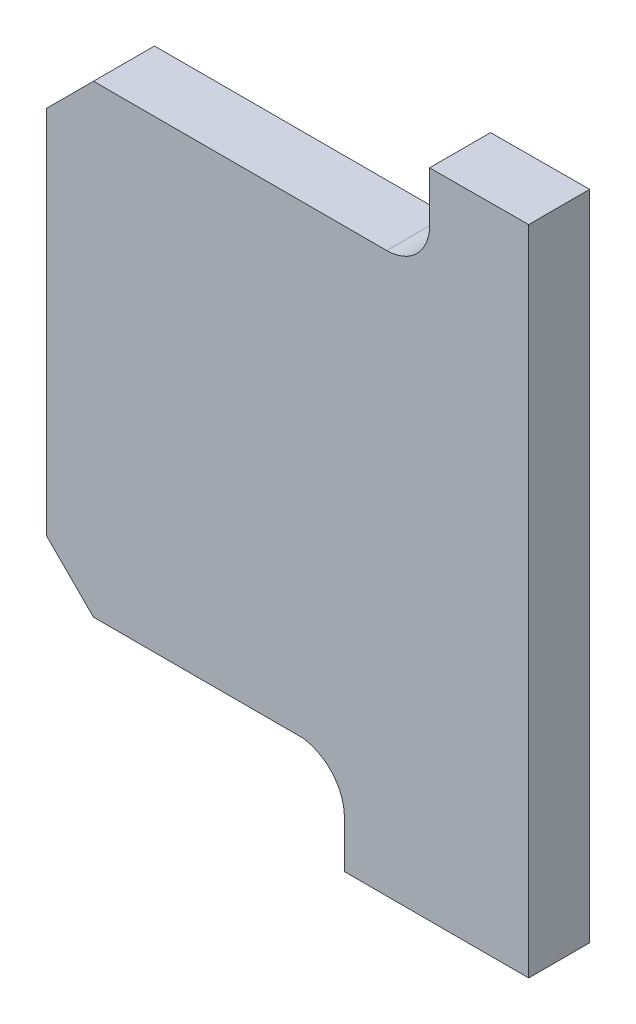
ISO-10303-21;
HEADER;
FILE_DESCRIPTION(('STEP AP214'),'2;1');
FILE_NAME('part.step','',(''),(''),'','','');
FILE_SCHEMA(('AUTOMOTIVE_DESIGN { 1 0 10303 214 1 1 1 1 }'));
ENDSEC;
DATA;
#1=APPLICATION_CONTEXT('core data for automotive mechanical design processes');
#2=APPLICATION_PROTOCOL_DEFINITION('international standard','automotive_design',2000,#1);
#3=PRODUCT_CONTEXT('',#1,'mechanical');
#4=PRODUCT('Part','Part','',(#3));
#5=PRODUCT_RELATED_PRODUCT_CATEGORY('part','',(#4));
#6=PRODUCT_DEFINITION_FORMATION('','',#4);
#7=PRODUCT_DEFINITION_CONTEXT('part definition',#1,'design');
#8=PRODUCT_DEFINITION('design','',#6,#7);
#9=PRODUCT_DEFINITION_SHAPE('','',#8);
#10=(LENGTH_UNIT() NAMED_UNIT(*) SI_UNIT(.MILLI.,.METRE.));
#11=(NAMED_UNIT(*) PLANE_ANGLE_UNIT() SI_UNIT($,.RADIAN.));
#12=(NAMED_UNIT(*) SI_UNIT($,.STERADIAN.) SOLID_ANGLE_UNIT());
#13=UNCERTAINTY_MEASURE_WITH_UNIT(LENGTH_MEASURE(1.E-05),#10,'distance_accuracy_value','');
#14=(GEOMETRIC_REPRESENTATION_CONTEXT(3) GLOBAL_UNCERTAINTY_ASSIGNED_CONTEXT((#13)) GLOBAL_UNIT_ASSIGNED_CONTEXT((#10,
#11,#12)) REPRESENTATION_CONTEXT('',''));
#15=CARTESIAN_POINT('',(0.,0.,0.));
#16=DIRECTION('',(0.,0.,1.));
#17=DIRECTION('',(1.,0.,0.));
#18=AXIS2_PLACEMENT_3D('',#15,#16,#17);
#19=CARTESIAN_POINT('',(-8.001,2.54278892,0.));
#20=DIRECTION('',(0.,0.,-1.));
#21=DIRECTION('',(-1.,0.,0.));
#22=AXIS2_PLACEMENT_3D('',#19,#20,#21);
#23=PLANE('',#22);
#24=DIRECTION('',(1.,0.,0.));
#25=VECTOR('',#24,1.);
#26=CARTESIAN_POINT('',(-6.73494208,1.276731,0.));
#27=LINE('',#26,#25);
#28=CARTESIAN_POINT('',(-6.73494208,1.276731,0.));
#29=VERTEX_POINT('',#28);
#30=CARTESIAN_POINT('',(-1.10865158000035,1.27673099999995,0.));
#31=VERTEX_POINT('',#30);
#32=EDGE_CURVE('E169',#29,#31,#27,.T.);
#33=ORIENTED_EDGE('',*,*,#32,.T.);
#34=CARTESIAN_POINT('',(-1.289470202044,1.573737595573E-06,0.));
#35=DIRECTION('',(0.,0.,-1.));
#36=DIRECTION('',(-1.,0.,0.));
#37=AXIS2_PLACEMENT_3D('',#34,#35,#36);
#38=CIRCLE('',#37,1.289470202045);
#39=CARTESIAN_POINT('',(0.,7.8686879788435E-07,0.));
#40=VERTEX_POINT('',#39);
#41=EDGE_CURVE('E190',#31,#40,#38,.T.);
#42=ORIENTED_EDGE('',*,*,#41,.T.);
#43=DIRECTION('',(0.,1.,0.));
#44=VECTOR('',#43,1.);
#45=CARTESIAN_POINT('',(0.,0.,0.));
#46=LINE('',#45,#44);
#47=CARTESIAN_POINT('',(0.,-1.27,0.));
#48=VERTEX_POINT('',#47);
#49=EDGE_CURVE('E151',#40,#48,#46,.F.);
#50=ORIENTED_EDGE('',*,*,#49,.T.);
#51=DIRECTION('',(1.,0.,0.));
#52=VECTOR('',#51,1.);
#53=CARTESIAN_POINT('',(0.,-1.27,0.));
#54=LINE('',#53,#52);
#55=CARTESIAN_POINT('',(4.946269,-1.27,0.));
#56=VERTEX_POINT('',#55);
#57=EDGE_CURVE('E124',#48,#56,#54,.T.);
#58=ORIENTED_EDGE('',*,*,#57,.T.);
#59=DIRECTION('',(0.,1.,0.));
#60=VECTOR('',#59,1.);
#61=CARTESIAN_POINT('',(4.946269,-1.27,0.));
#62=LINE('',#61,#60);
#63=CARTESIAN_POINT('',(4.946269,14.89670122,0.));
#64=VERTEX_POINT('',#63);
#65=EDGE_CURVE('E106',#56,#64,#62,.T.);
#66=ORIENTED_EDGE('',*,*,#65,.T.);
#67=DIRECTION('',(1.88658955520942E-06,-0.99999999999822,0.));
#68=VECTOR('',#67,1.);
#69=CARTESIAN_POINT('',(4.946269,14.89670122,0.));
#70=LINE('',#69,#68);
#71=CARTESIAN_POINT('',(4.94626646,16.243046,0.));
#72=VERTEX_POINT('',#71);
#73=EDGE_CURVE('E102',#64,#72,#70,.F.);
#74=ORIENTED_EDGE('',*,*,#73,.T.);
#75=DIRECTION('',(0.999991374981113,0.00415330752324947,0.));
#76=VECTOR('',#75,1.);
#77=CARTESIAN_POINT('',(4.94626646,16.243046,0.));
#78=LINE('',#77,#76);
#79=CARTESIAN_POINT('',(2.28600000000027,16.231997,0.));
#80=VERTEX_POINT('',#79);
#81=EDGE_CURVE('E104',#72,#80,#78,.F.);
#82=ORIENTED_EDGE('',*,*,#81,.T.);
#83=DIRECTION('',(-1.88658955553942E-06,0.99999999999822,0.));
#84=VECTOR('',#83,1.);
#85=CARTESIAN_POINT('',(2.286000000112,16.231937775282,0.));
#86=LINE('',#85,#84);
#87=CARTESIAN_POINT('',(2.28600253999423,14.885655422352,0.));
#88=VERTEX_POINT('',#87);
#89=EDGE_CURVE('E66',#80,#88,#86,.F.);
#90=ORIENTED_EDGE('',*,*,#89,.T.);
#91=CARTESIAN_POINT('',(1.135015086745,14.885656453263,0.));
#92=DIRECTION('',(0.,0.,-1.));
#93=DIRECTION('',(-1.,0.,0.));
#94=AXIS2_PLACEMENT_3D('',#91,#92,#93);
#95=CIRCLE('',#94,1.150987453263);
#96=CARTESIAN_POINT('',(1.1350146633725,13.7346690000002,0.));
#97=VERTEX_POINT('',#96);
#98=EDGE_CURVE('E19',#88,#97,#95,.T.);
#99=ORIENTED_EDGE('',*,*,#98,.T.);
#100=DIRECTION('',(1.,0.,0.));
#101=VECTOR('',#100,1.);
#102=CARTESIAN_POINT('',(1.009269,13.734669,0.));
#103=LINE('',#102,#101);
#104=CARTESIAN_POINT('',(-6.73494208,13.734669,0.));
#105=VERTEX_POINT('',#104);
#106=EDGE_CURVE('E74',#97,#105,#103,.F.);
#107=ORIENTED_EDGE('',*,*,#106,.T.);
#108=DIRECTION('',(0.707106781186548,0.707106781186548,0.));
#109=VECTOR('',#108,1.);
#110=CARTESIAN_POINT('',(-6.73494208,13.734669,0.));
#111=LINE('',#110,#109);
#112=CARTESIAN_POINT('',(-8.001,12.46861108,0.));
#113=VERTEX_POINT('',#112);
#114=EDGE_CURVE('E141',#105,#113,#111,.F.);
#115=ORIENTED_EDGE('',*,*,#114,.T.);
#116=DIRECTION('',(0.,1.,0.));
#117=VECTOR('',#116,1.);
#118=CARTESIAN_POINT('',(-8.001,12.46861108,0.));
#119=LINE('',#118,#117);
#120=CARTESIAN_POINT('',(-8.001,2.54278892,0.));
#121=VERTEX_POINT('',#120);
#122=EDGE_CURVE('E146',#113,#121,#119,.F.);
#123=ORIENTED_EDGE('',*,*,#122,.T.);
#124=DIRECTION('',(-0.707106781186548,0.707106781186548,0.));
#125=VECTOR('',#124,1.);
#126=CARTESIAN_POINT('',(-8.001,2.54278892,0.));
#127=LINE('',#126,#125);
#128=EDGE_CURVE('E148',#121,#29,#127,.F.);
#129=ORIENTED_EDGE('',*,*,#128,.T.);
#130=EDGE_LOOP('',(#33,#42,#50,#58,#66,#74,#82,#90,#99,#107,#115,#123,#129));
#131=FACE_BOUND('',#130,.T.);
#132=ADVANCED_FACE('F16',(#131),#23,.F.);
#133=CARTESIAN_POINT('',(-8.001,2.54278892,-1.6374872));
#134=DIRECTION('',(0.707106781186548,0.707106781186548,0.));
#135=DIRECTION('',(-0.707106781186548,0.707106781186548,0.));
#136=AXIS2_PLACEMENT_3D('',#133,#134,#135);
#137=PLANE('',#136);
#138=DIRECTION('',(0.,0.,1.));
#139=VECTOR('',#138,1.);
#140=CARTESIAN_POINT('',(-6.73494208,1.276731,-1.6374872));
#141=LINE('',#140,#139);
#142=CARTESIAN_POINT('',(-6.73494208,1.276731,-1.6374872));
#143=VERTEX_POINT('',#142);
#144=EDGE_CURVE('E172',#143,#29,#141,.T.);
#145=ORIENTED_EDGE('',*,*,#144,.T.);
#146=ORIENTED_EDGE('',*,*,#128,.F.);
#147=DIRECTION('',(0.,0.,-1.));
#148=VECTOR('',#147,1.);
#149=CARTESIAN_POINT('',(-8.001,2.54278892,-1.6374872));
#150=LINE('',#149,#148);
#151=CARTESIAN_POINT('',(-8.001,2.54278892,-1.6374872));
#152=VERTEX_POINT('',#151);
#153=EDGE_CURVE('E143',#121,#152,#150,.T.);
#154=ORIENTED_EDGE('',*,*,#153,.T.);
#155=DIRECTION('',(-0.707106781186548,0.707106781186548,0.));
#156=VECTOR('',#155,1.);
#157=CARTESIAN_POINT('',(-6.73494208,1.276731,-1.6374872));
#158=LINE('',#157,#156);
#159=EDGE_CURVE('E171',#143,#152,#158,.T.);
#160=ORIENTED_EDGE('',*,*,#159,.F.);
#161=EDGE_LOOP('',(#145,#146,#154,#160));
#162=FACE_BOUND('',#161,.T.);
#163=ADVANCED_FACE('F255',(#162),#137,.F.);
#164=CARTESIAN_POINT('',(-8.001,12.46861108,-1.6374872));
#165=DIRECTION('',(1.,0.,0.));
#166=DIRECTION('',(0.,0.,-1.));
#167=AXIS2_PLACEMENT_3D('',#164,#165,#166);
#168=PLANE('',#167);
#169=ORIENTED_EDGE('',*,*,#153,.F.);
#170=ORIENTED_EDGE('',*,*,#122,.F.);
#171=DIRECTION('',(0.,0.,1.));
#172=VECTOR('',#171,1.);
#173=CARTESIAN_POINT('',(-8.001,12.46861108,-1.6374872));
#174=LINE('',#173,#172);
#175=CARTESIAN_POINT('',(-8.001,12.46861108,-1.6374872));
#176=VERTEX_POINT('',#175);
#177=EDGE_CURVE('E138',#113,#176,#174,.F.);
#178=ORIENTED_EDGE('',*,*,#177,.T.);
#179=DIRECTION('',(0.,1.,0.));
#180=VECTOR('',#179,1.);
#181=CARTESIAN_POINT('',(-8.001,2.54278892,-1.6374872));
#182=LINE('',#181,#180);
#183=EDGE_CURVE('E209',#152,#176,#182,.T.);
#184=ORIENTED_EDGE('',*,*,#183,.F.);
#185=EDGE_LOOP('',(#169,#170,#178,#184));
#186=FACE_BOUND('',#185,.T.);
#187=ADVANCED_FACE('F383',(#186),#168,.F.);
#188=CARTESIAN_POINT('',(-6.73494208,13.734669,-1.6374872));
#189=DIRECTION('',(0.707106781186548,-0.707106781186548,0.));
#190=DIRECTION('',(0.707106781186548,0.707106781186548,0.));
#191=AXIS2_PLACEMENT_3D('',#188,#189,#190);
#192=PLANE('',#191);
#193=ORIENTED_EDGE('',*,*,#177,.F.);
#194=ORIENTED_EDGE('',*,*,#114,.F.);
#195=DIRECTION('',(0.,0.,-1.));
#196=VECTOR('',#195,1.);
#197=CARTESIAN_POINT('',(-6.73494208,13.734669,-1.6374872));
#198=LINE('',#197,#196);
#199=CARTESIAN_POINT('',(-6.73494208,13.734669,-1.6374872));
#200=VERTEX_POINT('',#199);
#201=EDGE_CURVE('E135',#105,#200,#198,.T.);
#202=ORIENTED_EDGE('',*,*,#201,.T.);
#203=DIRECTION('',(0.707106781186548,0.707106781186547,0.));
#204=VECTOR('',#203,1.);
#205=CARTESIAN_POINT('',(-8.001,12.46861108,-1.6374872));
#206=LINE('',#205,#204);
#207=EDGE_CURVE('E181',#176,#200,#206,.T.);
#208=ORIENTED_EDGE('',*,*,#207,.F.);
#209=EDGE_LOOP('',(#193,#194,#202,#208));
#210=FACE_BOUND('',#209,.T.);
#211=ADVANCED_FACE('F266',(#210),#192,.F.);
#212=CARTESIAN_POINT('',(1.009269,13.734669,-1.6374872));
#213=DIRECTION('',(0.,-1.,0.));
#214=DIRECTION('',(0.,0.,-1.));
#215=AXIS2_PLACEMENT_3D('',#212,#213,#214);
#216=PLANE('',#215);
#217=ORIENTED_EDGE('',*,*,#201,.F.);
#218=ORIENTED_EDGE('',*,*,#106,.F.);
#219=DIRECTION('',(0.,0.,-1.));
#220=VECTOR('',#219,1.);
#221=CARTESIAN_POINT('',(1.13501424,13.7346690000003,-1.6374872));
#222=LINE('',#221,#220);
#223=CARTESIAN_POINT('',(1.1350146633725,13.7346690000002,-1.6374872));
#224=VERTEX_POINT('',#223);
#225=EDGE_CURVE('E133',#97,#224,#222,.T.);
#226=ORIENTED_EDGE('',*,*,#225,.T.);
#227=DIRECTION('',(-1.,0.,0.));
#228=VECTOR('',#227,1.);
#229=CARTESIAN_POINT('',(-8.001,13.734669,-1.6374872));
#230=LINE('',#229,#228);
#231=EDGE_CURVE('E178',#200,#224,#230,.F.);
#232=ORIENTED_EDGE('',*,*,#231,.F.);
#233=EDGE_LOOP('',(#217,#218,#226,#232));
#234=FACE_BOUND('',#233,.T.);
#235=ADVANCED_FACE('F267',(#234),#216,.F.);
#236=CARTESIAN_POINT('',(1.135015086745,14.885656453263,-1.6374872));
#237=DIRECTION('',(0.,0.,-1.));
#238=DIRECTION('',(-1.,0.,0.));
#239=AXIS2_PLACEMENT_3D('',#236,#237,#238);
#240=CYLINDRICAL_SURFACE('',#239,1.150987453263);
#241=ORIENTED_EDGE('',*,*,#225,.F.);
#242=ORIENTED_EDGE('',*,*,#98,.F.);
#243=DIRECTION('',(0.,0.,1.));
#244=VECTOR('',#243,1.);
#245=CARTESIAN_POINT('',(2.28600254000027,14.88565222,-1.6374872));
#246=LINE('',#245,#244);
#247=CARTESIAN_POINT('',(2.28600254000013,14.8856543366315,-1.6374872));
#248=VERTEX_POINT('',#247);
#249=EDGE_CURVE('E117',#88,#248,#246,.F.);
#250=ORIENTED_EDGE('',*,*,#249,.T.);
#251=CARTESIAN_POINT('',(1.135015086745,14.885656453263,-1.6374872));
#252=DIRECTION('',(0.,0.,-1.));
#253=DIRECTION('',(-1.,0.,0.));
#254=AXIS2_PLACEMENT_3D('',#251,#252,#253);
#255=CIRCLE('',#254,1.150987453263);
#256=EDGE_CURVE('E180',#224,#248,#255,.F.);
#257=ORIENTED_EDGE('',*,*,#256,.F.);
#258=EDGE_LOOP('',(#241,#242,#250,#257));
#259=FACE_BOUND('',#258,.T.);
#260=ADVANCED_FACE('F270',(#259),#240,.F.);
#261=CARTESIAN_POINT('',(2.286000000112,16.231937775282,-1.6374872));
#262=DIRECTION('',(0.99999999999822,1.88658955553942E-06,0.));
#263=DIRECTION('',(-1.88658955553942E-06,0.99999999999822,0.));
#264=AXIS2_PLACEMENT_3D('',#261,#262,#263);
#265=PLANE('',#264);
#266=ORIENTED_EDGE('',*,*,#249,.F.);
#267=ORIENTED_EDGE('',*,*,#89,.F.);
#268=DIRECTION('',(0.,0.,-1.));
#269=VECTOR('',#268,1.);
#270=CARTESIAN_POINT('',(2.28600000000027,16.231997,-1.6374872));
#271=LINE('',#270,#269);
#272=CARTESIAN_POINT('',(2.28600000000027,16.231997,-1.6374872));
#273=VERTEX_POINT('',#272);
#274=EDGE_CURVE('E110',#80,#273,#271,.T.);
#275=ORIENTED_EDGE('',*,*,#274,.T.);
#276=DIRECTION('',(0.,1.,0.));
#277=VECTOR('',#276,1.);
#278=CARTESIAN_POINT('',(2.28600254,2.54278892,-1.6374872));
#279=LINE('',#278,#277);
#280=EDGE_CURVE('E189',#248,#273,#279,.T.);
#281=ORIENTED_EDGE('',*,*,#280,.F.);
#282=EDGE_LOOP('',(#266,#267,#275,#281));
#283=FACE_BOUND('',#282,.T.);
#284=ADVANCED_FACE('F196',(#283),#265,.F.);
#285=CARTESIAN_POINT('',(4.94626646,16.243046,-1.6374872));
#286=DIRECTION('',(0.00415330752324947,-0.999991374981113,0.));
#287=DIRECTION('',(0.999991374981113,0.00415330752324947,0.));
#288=AXIS2_PLACEMENT_3D('',#285,#286,#287);
#289=PLANE('',#288);
#290=ORIENTED_EDGE('',*,*,#274,.F.);
#291=ORIENTED_EDGE('',*,*,#81,.F.);
#292=DIRECTION('',(0.,0.,1.));
#293=VECTOR('',#292,1.);
#294=CARTESIAN_POINT('',(4.94626646,16.243046,-1.6374872));
#295=LINE('',#294,#293);
#296=CARTESIAN_POINT('',(4.94626646,16.243046,-1.6374872));
#297=VERTEX_POINT('',#296);
#298=EDGE_CURVE('E109',#72,#297,#295,.F.);
#299=ORIENTED_EDGE('',*,*,#298,.T.);
#300=DIRECTION('',(0.999991374981113,0.00415330752324916,0.));
#301=VECTOR('',#300,1.);
#302=CARTESIAN_POINT('',(2.286,16.231997,-1.6374872));
#303=LINE('',#302,#301);
#304=EDGE_CURVE('E198',#273,#297,#303,.T.);
#305=ORIENTED_EDGE('',*,*,#304,.F.);
#306=EDGE_LOOP('',(#290,#291,#299,#305));
#307=FACE_BOUND('',#306,.T.);
#308=ADVANCED_FACE('F114',(#307),#289,.F.);
#309=CARTESIAN_POINT('',(4.946269,-1.27,-1.6374872));
#310=DIRECTION('',(-1.,0.,0.));
#311=DIRECTION('',(0.,0.,1.));
#312=AXIS2_PLACEMENT_3D('',#309,#310,#311);
#313=PLANE('',#312);
#314=DIRECTION('',(0.,0.,1.));
#315=VECTOR('',#314,1.);
#316=CARTESIAN_POINT('',(4.946269,-1.27,-1.6374872));
#317=LINE('',#316,#315);
#318=CARTESIAN_POINT('',(4.946269,-1.27,-1.6374872));
#319=VERTEX_POINT('',#318);
#320=EDGE_CURVE('E154',#56,#319,#317,.F.);
#321=ORIENTED_EDGE('',*,*,#320,.T.);
#322=DIRECTION('',(0.,1.,0.));
#323=VECTOR('',#322,1.);
#324=CARTESIAN_POINT('',(4.94626646,2.54278892,-1.6374872));
#325=LINE('',#324,#323);
#326=EDGE_CURVE('E121',#297,#319,#325,.F.);
#327=ORIENTED_EDGE('',*,*,#326,.F.);
#328=ORIENTED_EDGE('',*,*,#298,.F.);
#329=ORIENTED_EDGE('',*,*,#73,.F.);
#330=ORIENTED_EDGE('',*,*,#65,.F.);
#331=EDGE_LOOP('',(#321,#327,#328,#329,#330));
#332=FACE_BOUND('',#331,.T.);
#333=ADVANCED_FACE('F120',(#332),#313,.F.);
#334=CARTESIAN_POINT('',(0.,-1.27,-1.6374872));
#335=DIRECTION('',(0.,1.,0.));
#336=DIRECTION('',(0.,0.,1.));
#337=AXIS2_PLACEMENT_3D('',#334,#335,#336);
#338=PLANE('',#337);
#339=ORIENTED_EDGE('',*,*,#320,.F.);
#340=ORIENTED_EDGE('',*,*,#57,.F.);
#341=DIRECTION('',(0.,0.,-1.));
#342=VECTOR('',#341,1.);
#343=CARTESIAN_POINT('',(0.,-1.27,-1.6374872));
#344=LINE('',#343,#342);
#345=CARTESIAN_POINT('',(0.,-1.27,-1.6374872));
#346=VERTEX_POINT('',#345);
#347=EDGE_CURVE('E153',#48,#346,#344,.T.);
#348=ORIENTED_EDGE('',*,*,#347,.T.);
#349=DIRECTION('',(-1.,0.,0.));
#350=VECTOR('',#349,1.);
#351=CARTESIAN_POINT('',(-8.001,-1.27,-1.6374872));
#352=LINE('',#351,#350);
#353=EDGE_CURVE('E221',#319,#346,#352,.T.);
#354=ORIENTED_EDGE('',*,*,#353,.F.);
#355=EDGE_LOOP('',(#339,#340,#348,#354));
#356=FACE_BOUND('',#355,.T.);
#357=ADVANCED_FACE('F233',(#356),#338,.F.);
#358=CARTESIAN_POINT('',(0.,0.,-1.6374872));
#359=DIRECTION('',(1.,0.,0.));
#360=DIRECTION('',(0.,0.,-1.));
#361=AXIS2_PLACEMENT_3D('',#358,#359,#360);
#362=PLANE('',#361);
#363=ORIENTED_EDGE('',*,*,#347,.F.);
#364=ORIENTED_EDGE('',*,*,#49,.F.);
#365=DIRECTION('',(0.,0.,-1.));
#366=VECTOR('',#365,1.);
#367=CARTESIAN_POINT('',(0.,0.,-1.6374872));
#368=LINE('',#367,#366);
#369=CARTESIAN_POINT('',(0.,7.86868797835425E-07,-1.6374872));
#370=VERTEX_POINT('',#369);
#371=EDGE_CURVE('E191',#40,#370,#368,.T.);
#372=ORIENTED_EDGE('',*,*,#371,.T.);
#373=DIRECTION('',(0.,1.,0.));
#374=VECTOR('',#373,1.);
#375=CARTESIAN_POINT('',(0.,2.54278892,-1.6374872));
#376=LINE('',#375,#374);
#377=EDGE_CURVE('E186',#346,#370,#376,.T.);
#378=ORIENTED_EDGE('',*,*,#377,.F.);
#379=EDGE_LOOP('',(#363,#364,#372,#378));
#380=FACE_BOUND('',#379,.T.);
#381=ADVANCED_FACE('F238',(#380),#362,.F.);
#382=CARTESIAN_POINT('',(-1.289470202044,1.573737595573E-06,-1.6374872));
#383=DIRECTION('',(0.,0.,-1.));
#384=DIRECTION('',(-1.,0.,0.));
#385=AXIS2_PLACEMENT_3D('',#382,#383,#384);
#386=CYLINDRICAL_SURFACE('',#385,1.289470202045);
#387=ORIENTED_EDGE('',*,*,#371,.F.);
#388=ORIENTED_EDGE('',*,*,#41,.F.);
#389=DIRECTION('',(0.,0.,-1.));
#390=VECTOR('',#389,1.);
#391=CARTESIAN_POINT('',(-1.10865158000001,1.27673099999991,-1.6374872));
#392=LINE('',#391,#390);
#393=CARTESIAN_POINT('',(-1.10865158000035,1.27673099999995,-1.6374872));
#394=VERTEX_POINT('',#393);
#395=EDGE_CURVE('E192',#394,#31,#392,.F.);
#396=ORIENTED_EDGE('',*,*,#395,.F.);
#397=CARTESIAN_POINT('',(-1.289470202044,1.573737595573E-06,-1.6374872));
#398=DIRECTION('',(0.,0.,-1.));
#399=DIRECTION('',(-1.,0.,0.));
#400=AXIS2_PLACEMENT_3D('',#397,#398,#399);
#401=CIRCLE('',#400,1.289470202045);
#402=EDGE_CURVE('E25',#370,#394,#401,.F.);
#403=ORIENTED_EDGE('',*,*,#402,.F.);
#404=EDGE_LOOP('',(#387,#388,#396,#403));
#405=FACE_BOUND('',#404,.T.);
#406=ADVANCED_FACE('F246',(#405),#386,.F.);
#407=CARTESIAN_POINT('',(-6.73494208,1.276731,-1.6374872));
#408=DIRECTION('',(0.,1.,0.));
#409=DIRECTION('',(0.,0.,1.));
#410=AXIS2_PLACEMENT_3D('',#407,#408,#409);
#411=PLANE('',#410);
#412=DIRECTION('',(-1.,0.,0.));
#413=VECTOR('',#412,1.);
#414=CARTESIAN_POINT('',(-8.001,1.276731,-1.6374872));
#415=LINE('',#414,#413);
#416=EDGE_CURVE('E10',#394,#143,#415,.T.);
#417=ORIENTED_EDGE('',*,*,#416,.F.);
#418=ORIENTED_EDGE('',*,*,#395,.T.);
#419=ORIENTED_EDGE('',*,*,#32,.F.);
#420=ORIENTED_EDGE('',*,*,#144,.F.);
#421=EDGE_LOOP('',(#417,#418,#419,#420));
#422=FACE_BOUND('',#421,.T.);
#423=ADVANCED_FACE('F249',(#422),#411,.F.);
#424=CARTESIAN_POINT('',(-8.001,2.54278892,-1.6374872));
#425=DIRECTION('',(0.,0.,-1.));
#426=DIRECTION('',(-1.,0.,0.));
#427=AXIS2_PLACEMENT_3D('',#424,#425,#426);
#428=PLANE('',#427);
#429=ORIENTED_EDGE('',*,*,#402,.T.);
#430=ORIENTED_EDGE('',*,*,#416,.T.);
#431=ORIENTED_EDGE('',*,*,#159,.T.);
#432=ORIENTED_EDGE('',*,*,#183,.T.);
#433=ORIENTED_EDGE('',*,*,#207,.T.);
#434=ORIENTED_EDGE('',*,*,#231,.T.);
#435=ORIENTED_EDGE('',*,*,#256,.T.);
#436=ORIENTED_EDGE('',*,*,#280,.T.);
#437=ORIENTED_EDGE('',*,*,#304,.T.);
#438=ORIENTED_EDGE('',*,*,#326,.T.);
#439=ORIENTED_EDGE('',*,*,#353,.T.);
#440=ORIENTED_EDGE('',*,*,#377,.T.);
#441=EDGE_LOOP('',(#429,#430,#431,#432,#433,#434,#435,#436,#437,#438,#439,#440));
#442=FACE_BOUND('',#441,.T.);
#443=ADVANCED_FACE('F201',(#442),#428,.T.);
#444=CLOSED_SHELL('',(#132,#163,#187,#211,#235,#260,#284,#308,#333,#357,#381,#406,#423,#443));
#445=MANIFOLD_SOLID_BREP('B1',#444);
#446=ADVANCED_BREP_SHAPE_REPRESENTATION('',(#18,#445),#14);
#447=SHAPE_DEFINITION_REPRESENTATION(#9,#446);
ENDSEC;
END-ISO-10303-21;
